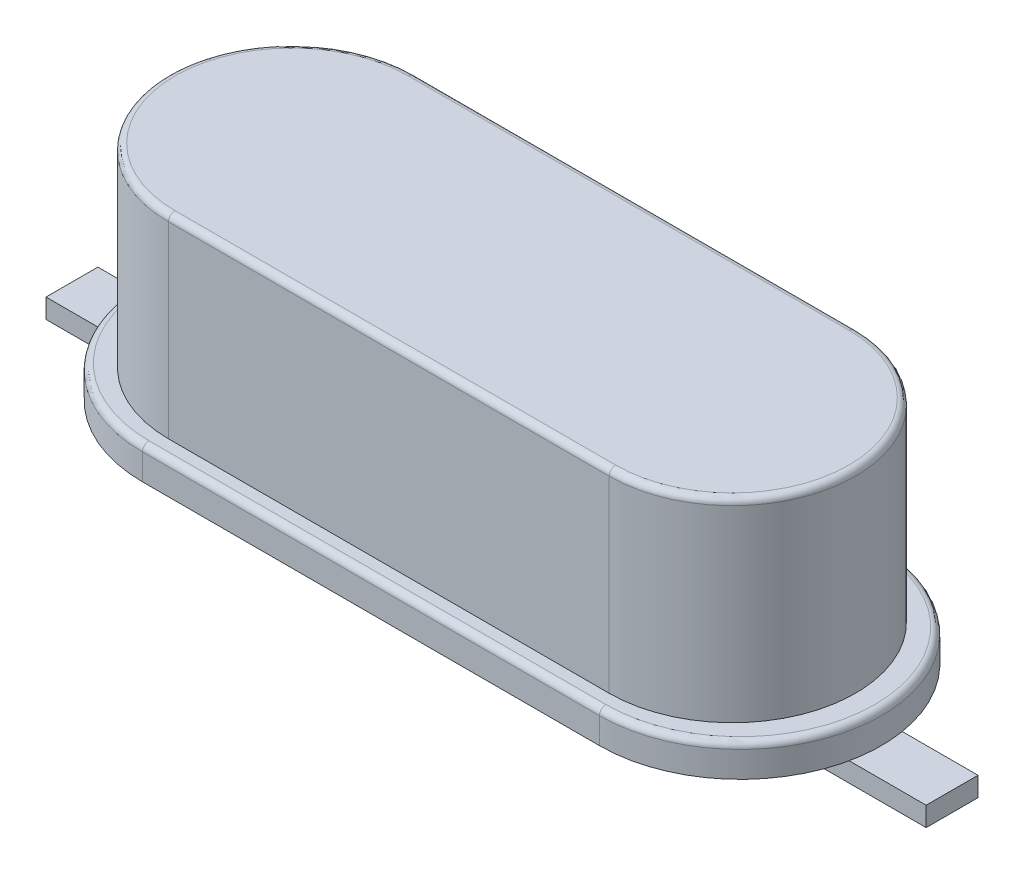
ISO-10303-21;
HEADER;
FILE_DESCRIPTION(('STEP AP214'),'2;1');
FILE_NAME('part.step','',(''),(''),'','','');
FILE_SCHEMA(('AUTOMOTIVE_DESIGN { 1 0 10303 214 1 1 1 1 }'));
ENDSEC;
DATA;
#1=APPLICATION_CONTEXT('core data for automotive mechanical design processes');
#2=APPLICATION_PROTOCOL_DEFINITION('international standard','automotive_design',2000,#1);
#3=PRODUCT_CONTEXT('',#1,'mechanical');
#4=PRODUCT('Part','Part','',(#3));
#5=PRODUCT_RELATED_PRODUCT_CATEGORY('part','',(#4));
#6=PRODUCT_DEFINITION_FORMATION('','',#4);
#7=PRODUCT_DEFINITION_CONTEXT('part definition',#1,'design');
#8=PRODUCT_DEFINITION('design','',#6,#7);
#9=PRODUCT_DEFINITION_SHAPE('','',#8);
#10=(LENGTH_UNIT() NAMED_UNIT(*) SI_UNIT(.MILLI.,.METRE.));
#11=(NAMED_UNIT(*) PLANE_ANGLE_UNIT() SI_UNIT($,.RADIAN.));
#12=(NAMED_UNIT(*) SI_UNIT($,.STERADIAN.) SOLID_ANGLE_UNIT());
#13=UNCERTAINTY_MEASURE_WITH_UNIT(LENGTH_MEASURE(1.E-05),#10,'distance_accuracy_value','');
#14=(GEOMETRIC_REPRESENTATION_CONTEXT(3) GLOBAL_UNCERTAINTY_ASSIGNED_CONTEXT((#13)) GLOBAL_UNIT_ASSIGNED_CONTEXT((#10,
#11,#12)) REPRESENTATION_CONTEXT('',''));
#15=CARTESIAN_POINT('',(0.,0.,0.));
#16=DIRECTION('',(0.,0.,1.));
#17=DIRECTION('',(1.,0.,0.));
#18=AXIS2_PLACEMENT_3D('',#15,#16,#17);
#19=CARTESIAN_POINT('',(-3.525,0.,0.));
#20=DIRECTION('',(0.,1.,0.));
#21=DIRECTION('',(0.,0.,1.));
#22=AXIS2_PLACEMENT_3D('',#19,#20,#21);
#23=PLANE('',#22);
#24=DIRECTION('',(0.,0.,1.));
#25=VECTOR('',#24,1.);
#26=CARTESIAN_POINT('',(-2.29,0.,0.4));
#27=LINE('',#26,#25);
#28=CARTESIAN_POINT('',(-2.29,0.,-0.4));
#29=VERTEX_POINT('',#28);
#30=CARTESIAN_POINT('',(-2.29,0.,0.4));
#31=VERTEX_POINT('',#30);
#32=EDGE_CURVE('E269',#29,#31,#27,.T.);
#33=ORIENTED_EDGE('',*,*,#32,.F.);
#34=DIRECTION('',(1.,0.,0.));
#35=VECTOR('',#34,1.);
#36=CARTESIAN_POINT('',(-2.59,0.,-0.4));
#37=LINE('',#36,#35);
#38=CARTESIAN_POINT('',(-2.59,0.,-0.4));
#39=VERTEX_POINT('',#38);
#40=EDGE_CURVE('E273',#39,#29,#37,.T.);
#41=ORIENTED_EDGE('',*,*,#40,.F.);
#42=DIRECTION('',(0.,0.,-1.));
#43=VECTOR('',#42,1.);
#44=CARTESIAN_POINT('',(-2.59,0.,0.4));
#45=LINE('',#44,#43);
#46=CARTESIAN_POINT('',(-2.59,0.,0.4));
#47=VERTEX_POINT('',#46);
#48=EDGE_CURVE('E282',#47,#39,#45,.T.);
#49=ORIENTED_EDGE('',*,*,#48,.F.);
#50=DIRECTION('',(-1.,0.,0.));
#51=VECTOR('',#50,1.);
#52=CARTESIAN_POINT('',(-2.59,0.,0.4));
#53=LINE('',#52,#51);
#54=EDGE_CURVE('E279',#31,#47,#53,.T.);
#55=ORIENTED_EDGE('',*,*,#54,.F.);
#56=EDGE_LOOP('',(#33,#41,#49,#55));
#57=FACE_BOUND('',#56,.T.);
#58=CARTESIAN_POINT('',(-3.525,0.,0.));
#59=DIRECTION('',(0.,1.,0.));
#60=DIRECTION('',(0.,0.,1.));
#61=AXIS2_PLACEMENT_3D('',#58,#59,#60);
#62=CIRCLE('',#61,2.175);
#63=CARTESIAN_POINT('',(-3.525,0.,-2.175));
#64=VERTEX_POINT('',#63);
#65=CARTESIAN_POINT('',(-3.525,0.,2.175));
#66=VERTEX_POINT('',#65);
#67=EDGE_CURVE('E313',#64,#66,#62,.T.);
#68=ORIENTED_EDGE('',*,*,#67,.F.);
#69=DIRECTION('',(-1.,0.,0.));
#70=VECTOR('',#69,1.);
#71=CARTESIAN_POINT('',(-3.525,0.,-2.175));
#72=LINE('',#71,#70);
#73=CARTESIAN_POINT('',(3.525,0.,-2.175));
#74=VERTEX_POINT('',#73);
#75=EDGE_CURVE('E323',#74,#64,#72,.T.);
#76=ORIENTED_EDGE('',*,*,#75,.F.);
#77=CARTESIAN_POINT('',(3.525,0.,0.));
#78=DIRECTION('',(0.,1.,0.));
#79=DIRECTION('',(0.,0.,1.));
#80=AXIS2_PLACEMENT_3D('',#77,#78,#79);
#81=CIRCLE('',#80,2.175);
#82=CARTESIAN_POINT('',(3.525,0.,2.175));
#83=VERTEX_POINT('',#82);
#84=EDGE_CURVE('E320',#83,#74,#81,.T.);
#85=ORIENTED_EDGE('',*,*,#84,.F.);
#86=DIRECTION('',(1.,0.,0.));
#87=VECTOR('',#86,1.);
#88=CARTESIAN_POINT('',(-3.525,0.,2.175));
#89=LINE('',#88,#87);
#90=EDGE_CURVE('E316',#66,#83,#89,.T.);
#91=ORIENTED_EDGE('',*,*,#90,.F.);
#92=EDGE_LOOP('',(#68,#76,#85,#91));
#93=FACE_BOUND('',#92,.T.);
#94=DIRECTION('',(-1.,0.,0.));
#95=VECTOR('',#94,1.);
#96=CARTESIAN_POINT('',(2.59,0.,0.4));
#97=LINE('',#96,#95);
#98=CARTESIAN_POINT('',(2.59,0.,0.4));
#99=VERTEX_POINT('',#98);
#100=CARTESIAN_POINT('',(2.29,0.,0.4));
#101=VERTEX_POINT('',#100);
#102=EDGE_CURVE('E249',#99,#101,#97,.T.);
#103=ORIENTED_EDGE('',*,*,#102,.F.);
#104=DIRECTION('',(0.,0.,1.));
#105=VECTOR('',#104,1.);
#106=CARTESIAN_POINT('',(2.59,0.,0.4));
#107=LINE('',#106,#105);
#108=CARTESIAN_POINT('',(2.59,0.,-0.4));
#109=VERTEX_POINT('',#108);
#110=EDGE_CURVE('E254',#109,#99,#107,.T.);
#111=ORIENTED_EDGE('',*,*,#110,.F.);
#112=DIRECTION('',(1.,0.,0.));
#113=VECTOR('',#112,1.);
#114=CARTESIAN_POINT('',(2.59,0.,-0.4));
#115=LINE('',#114,#113);
#116=CARTESIAN_POINT('',(2.29,0.,-0.4));
#117=VERTEX_POINT('',#116);
#118=EDGE_CURVE('E262',#117,#109,#115,.T.);
#119=ORIENTED_EDGE('',*,*,#118,.F.);
#120=DIRECTION('',(0.,0.,-1.));
#121=VECTOR('',#120,1.);
#122=CARTESIAN_POINT('',(2.29,0.,0.4));
#123=LINE('',#122,#121);
#124=EDGE_CURVE('E259',#101,#117,#123,.T.);
#125=ORIENTED_EDGE('',*,*,#124,.F.);
#126=EDGE_LOOP('',(#103,#111,#119,#125));
#127=FACE_BOUND('',#126,.T.);
#128=ADVANCED_FACE('F32',(#57,#93,#127),#23,.F.);
#129=CARTESIAN_POINT('',(-3.525,0.5,0.));
#130=DIRECTION('',(0.,1.,0.));
#131=DIRECTION('',(0.,0.,1.));
#132=AXIS2_PLACEMENT_3D('',#129,#130,#131);
#133=PLANE('',#132);
#134=CARTESIAN_POINT('',(3.525,0.5,0.));
#135=DIRECTION('',(0.,1.,0.));
#136=DIRECTION('',(0.,0.,1.));
#137=AXIS2_PLACEMENT_3D('',#134,#135,#136);
#138=CIRCLE('',#137,2.075);
#139=CARTESIAN_POINT('',(3.525,0.5,2.075));
#140=VERTEX_POINT('',#139);
#141=CARTESIAN_POINT('',(3.525,0.5,-2.075));
#142=VERTEX_POINT('',#141);
#143=EDGE_CURVE('E338',#140,#142,#138,.T.);
#144=ORIENTED_EDGE('',*,*,#143,.T.);
#145=DIRECTION('',(-1.,0.,0.));
#146=VECTOR('',#145,1.);
#147=CARTESIAN_POINT('',(-3.525,0.5,-2.075));
#148=LINE('',#147,#146);
#149=CARTESIAN_POINT('',(-3.525,0.5,-2.075));
#150=VERTEX_POINT('',#149);
#151=EDGE_CURVE('E340',#142,#150,#148,.T.);
#152=ORIENTED_EDGE('',*,*,#151,.T.);
#153=CARTESIAN_POINT('',(-3.525,0.5,0.));
#154=DIRECTION('',(0.,1.,0.));
#155=DIRECTION('',(0.,0.,1.));
#156=AXIS2_PLACEMENT_3D('',#153,#154,#155);
#157=CIRCLE('',#156,2.075);
#158=CARTESIAN_POINT('',(-3.525,0.5,2.075));
#159=VERTEX_POINT('',#158);
#160=EDGE_CURVE('E334',#150,#159,#157,.T.);
#161=ORIENTED_EDGE('',*,*,#160,.T.);
#162=DIRECTION('',(1.,0.,0.));
#163=VECTOR('',#162,1.);
#164=CARTESIAN_POINT('',(3.525,0.5,2.075));
#165=LINE('',#164,#163);
#166=EDGE_CURVE('E336',#159,#140,#165,.T.);
#167=ORIENTED_EDGE('',*,*,#166,.T.);
#168=EDGE_LOOP('',(#144,#152,#161,#167));
#169=FACE_BOUND('',#168,.T.);
#170=DIRECTION('',(1.,0.,0.));
#171=VECTOR('',#170,1.);
#172=CARTESIAN_POINT('',(-3.4,0.5,1.9));
#173=LINE('',#172,#171);
#174=CARTESIAN_POINT('',(-3.4,0.5,1.9));
#175=VERTEX_POINT('',#174);
#176=CARTESIAN_POINT('',(3.4,0.5,1.9));
#177=VERTEX_POINT('',#176);
#178=EDGE_CURVE('E294',#175,#177,#173,.T.);
#179=ORIENTED_EDGE('',*,*,#178,.F.);
#180=CARTESIAN_POINT('',(-3.4,0.5,0.));
#181=DIRECTION('',(0.,1.,0.));
#182=DIRECTION('',(0.,0.,1.));
#183=AXIS2_PLACEMENT_3D('',#180,#181,#182);
#184=CIRCLE('',#183,1.9);
#185=CARTESIAN_POINT('',(-3.4,0.5,-1.9));
#186=VERTEX_POINT('',#185);
#187=EDGE_CURVE('E291',#186,#175,#184,.T.);
#188=ORIENTED_EDGE('',*,*,#187,.F.);
#189=DIRECTION('',(-1.,0.,0.));
#190=VECTOR('',#189,1.);
#191=CARTESIAN_POINT('',(-3.4,0.5,-1.9));
#192=LINE('',#191,#190);
#193=CARTESIAN_POINT('',(3.4,0.5,-1.9));
#194=VERTEX_POINT('',#193);
#195=EDGE_CURVE('E301',#194,#186,#192,.T.);
#196=ORIENTED_EDGE('',*,*,#195,.F.);
#197=CARTESIAN_POINT('',(3.4,0.5,0.));
#198=DIRECTION('',(0.,1.,0.));
#199=DIRECTION('',(0.,0.,1.));
#200=AXIS2_PLACEMENT_3D('',#197,#198,#199);
#201=CIRCLE('',#200,1.9);
#202=EDGE_CURVE('E298',#177,#194,#201,.T.);
#203=ORIENTED_EDGE('',*,*,#202,.F.);
#204=EDGE_LOOP('',(#179,#188,#196,#203));
#205=FACE_BOUND('',#204,.T.);
#206=ADVANCED_FACE('F448',(#169,#205),#133,.T.);
#207=CARTESIAN_POINT('',(-3.525,0.5,0.));
#208=DIRECTION('',(0.,-1.,0.));
#209=DIRECTION('',(0.,0.,-1.));
#210=AXIS2_PLACEMENT_3D('',#207,#208,#209);
#211=CYLINDRICAL_SURFACE('',#210,2.175);
#212=DIRECTION('',(0.,-1.,0.));
#213=VECTOR('',#212,1.);
#214=CARTESIAN_POINT('',(-3.525,0.5,2.175));
#215=LINE('',#214,#213);
#216=CARTESIAN_POINT('',(-3.525,0.4,2.175));
#217=VERTEX_POINT('',#216);
#218=EDGE_CURVE('E332',#217,#66,#215,.T.);
#219=ORIENTED_EDGE('',*,*,#218,.F.);
#220=CARTESIAN_POINT('',(-3.525,0.4,0.));
#221=DIRECTION('',(0.,1.,0.));
#222=DIRECTION('',(0.,0.,1.));
#223=AXIS2_PLACEMENT_3D('',#220,#221,#222);
#224=CIRCLE('',#223,2.175);
#225=CARTESIAN_POINT('',(-3.525,0.4,-2.175));
#226=VERTEX_POINT('',#225);
#227=EDGE_CURVE('E350',#217,#226,#224,.F.);
#228=ORIENTED_EDGE('',*,*,#227,.T.);
#229=DIRECTION('',(0.,-1.,0.));
#230=VECTOR('',#229,1.);
#231=CARTESIAN_POINT('',(-3.525,0.5,-2.175));
#232=LINE('',#231,#230);
#233=EDGE_CURVE('E326',#226,#64,#232,.T.);
#234=ORIENTED_EDGE('',*,*,#233,.T.);
#235=ORIENTED_EDGE('',*,*,#67,.T.);
#236=EDGE_LOOP('',(#219,#228,#234,#235));
#237=FACE_BOUND('',#236,.T.);
#238=ADVANCED_FACE('F453',(#237),#211,.T.);
#239=CARTESIAN_POINT('',(-3.525,0.5,2.175));
#240=DIRECTION('',(0.,0.,-1.));
#241=DIRECTION('',(-1.,0.,0.));
#242=AXIS2_PLACEMENT_3D('',#239,#240,#241);
#243=PLANE('',#242);
#244=DIRECTION('',(0.,-1.,0.));
#245=VECTOR('',#244,1.);
#246=CARTESIAN_POINT('',(3.525,0.5,2.175));
#247=LINE('',#246,#245);
#248=CARTESIAN_POINT('',(3.525,0.4,2.175));
#249=VERTEX_POINT('',#248);
#250=EDGE_CURVE('E330',#249,#83,#247,.T.);
#251=ORIENTED_EDGE('',*,*,#250,.F.);
#252=DIRECTION('',(1.,0.,0.));
#253=VECTOR('',#252,1.);
#254=CARTESIAN_POINT('',(-3.525,0.4,2.175));
#255=LINE('',#254,#253);
#256=EDGE_CURVE('E348',#249,#217,#255,.F.);
#257=ORIENTED_EDGE('',*,*,#256,.T.);
#258=ORIENTED_EDGE('',*,*,#218,.T.);
#259=ORIENTED_EDGE('',*,*,#90,.T.);
#260=EDGE_LOOP('',(#251,#257,#258,#259));
#261=FACE_BOUND('',#260,.T.);
#262=ADVANCED_FACE('F466',(#261),#243,.F.);
#263=CARTESIAN_POINT('',(3.525,0.5,0.));
#264=DIRECTION('',(0.,-1.,0.));
#265=DIRECTION('',(0.,0.,-1.));
#266=AXIS2_PLACEMENT_3D('',#263,#264,#265);
#267=CYLINDRICAL_SURFACE('',#266,2.175);
#268=DIRECTION('',(0.,-1.,0.));
#269=VECTOR('',#268,1.);
#270=CARTESIAN_POINT('',(3.525,0.5,-2.175));
#271=LINE('',#270,#269);
#272=CARTESIAN_POINT('',(3.525,0.4,-2.175));
#273=VERTEX_POINT('',#272);
#274=EDGE_CURVE('E328',#273,#74,#271,.T.);
#275=ORIENTED_EDGE('',*,*,#274,.F.);
#276=CARTESIAN_POINT('',(3.525,0.4,0.));
#277=DIRECTION('',(0.,1.,0.));
#278=DIRECTION('',(0.,0.,1.));
#279=AXIS2_PLACEMENT_3D('',#276,#277,#278);
#280=CIRCLE('',#279,2.175);
#281=EDGE_CURVE('E346',#273,#249,#280,.F.);
#282=ORIENTED_EDGE('',*,*,#281,.T.);
#283=ORIENTED_EDGE('',*,*,#250,.T.);
#284=ORIENTED_EDGE('',*,*,#84,.T.);
#285=EDGE_LOOP('',(#275,#282,#283,#284));
#286=FACE_BOUND('',#285,.T.);
#287=ADVANCED_FACE('F462',(#286),#267,.T.);
#288=CARTESIAN_POINT('',(-3.525,0.5,-2.175));
#289=DIRECTION('',(0.,0.,1.));
#290=DIRECTION('',(1.,0.,0.));
#291=AXIS2_PLACEMENT_3D('',#288,#289,#290);
#292=PLANE('',#291);
#293=ORIENTED_EDGE('',*,*,#233,.F.);
#294=DIRECTION('',(-1.,0.,0.));
#295=VECTOR('',#294,1.);
#296=CARTESIAN_POINT('',(3.525,0.4,-2.175));
#297=LINE('',#296,#295);
#298=EDGE_CURVE('E343',#226,#273,#297,.F.);
#299=ORIENTED_EDGE('',*,*,#298,.T.);
#300=ORIENTED_EDGE('',*,*,#274,.T.);
#301=ORIENTED_EDGE('',*,*,#75,.T.);
#302=EDGE_LOOP('',(#293,#299,#300,#301));
#303=FACE_BOUND('',#302,.T.);
#304=ADVANCED_FACE('F458',(#303),#292,.F.);
#305=CARTESIAN_POINT('',(-3.525,0.4,2.075));
#306=DIRECTION('',(-1.,0.,0.));
#307=DIRECTION('',(0.,0.,1.));
#308=AXIS2_PLACEMENT_3D('',#305,#306,#307);
#309=CYLINDRICAL_SURFACE('',#308,0.1);
#310=CARTESIAN_POINT('',(-3.525,0.4,2.075));
#311=DIRECTION('',(-1.,0.,0.));
#312=DIRECTION('',(0.,0.,1.));
#313=AXIS2_PLACEMENT_3D('',#310,#311,#312);
#314=CIRCLE('',#313,0.1);
#315=EDGE_CURVE('E356',#217,#159,#314,.T.);
#316=ORIENTED_EDGE('',*,*,#315,.F.);
#317=ORIENTED_EDGE('',*,*,#256,.F.);
#318=CARTESIAN_POINT('',(3.525,0.4,2.075));
#319=DIRECTION('',(1.,0.,0.));
#320=DIRECTION('',(0.,0.,-1.));
#321=AXIS2_PLACEMENT_3D('',#318,#319,#320);
#322=CIRCLE('',#321,0.1);
#323=EDGE_CURVE('E317',#140,#249,#322,.T.);
#324=ORIENTED_EDGE('',*,*,#323,.F.);
#325=ORIENTED_EDGE('',*,*,#166,.F.);
#326=EDGE_LOOP('',(#316,#317,#324,#325));
#327=FACE_BOUND('',#326,.T.);
#328=ADVANCED_FACE('F461',(#327),#309,.T.);
#329=CARTESIAN_POINT('',(3.525,0.4,0.));
#330=DIRECTION('',(0.,1.,0.));
#331=DIRECTION('',(0.,0.,1.));
#332=AXIS2_PLACEMENT_3D('',#329,#330,#331);
#333=TOROIDAL_SURFACE('',#332,2.075,0.1);
#334=ORIENTED_EDGE('',*,*,#323,.T.);
#335=ORIENTED_EDGE('',*,*,#281,.F.);
#336=CARTESIAN_POINT('',(3.525,0.4,-2.075));
#337=DIRECTION('',(-1.,0.,0.));
#338=DIRECTION('',(0.,0.,1.));
#339=AXIS2_PLACEMENT_3D('',#336,#337,#338);
#340=CIRCLE('',#339,0.1);
#341=EDGE_CURVE('E354',#142,#273,#340,.T.);
#342=ORIENTED_EDGE('',*,*,#341,.F.);
#343=ORIENTED_EDGE('',*,*,#143,.F.);
#344=EDGE_LOOP('',(#334,#335,#342,#343));
#345=FACE_BOUND('',#344,.T.);
#346=ADVANCED_FACE('F482',(#345),#333,.T.);
#347=CARTESIAN_POINT('',(-3.525,0.4,0.));
#348=DIRECTION('',(0.,1.,0.));
#349=DIRECTION('',(0.,0.,1.));
#350=AXIS2_PLACEMENT_3D('',#347,#348,#349);
#351=TOROIDAL_SURFACE('',#350,2.075,0.1);
#352=ORIENTED_EDGE('',*,*,#315,.T.);
#353=ORIENTED_EDGE('',*,*,#160,.F.);
#354=CARTESIAN_POINT('',(-3.525,0.4,-2.075));
#355=DIRECTION('',(1.,0.,0.));
#356=DIRECTION('',(0.,0.,-1.));
#357=AXIS2_PLACEMENT_3D('',#354,#355,#356);
#358=CIRCLE('',#357,0.1);
#359=EDGE_CURVE('E312',#226,#150,#358,.T.);
#360=ORIENTED_EDGE('',*,*,#359,.F.);
#361=ORIENTED_EDGE('',*,*,#227,.F.);
#362=EDGE_LOOP('',(#352,#353,#360,#361));
#363=FACE_BOUND('',#362,.T.);
#364=ADVANCED_FACE('F478',(#363),#351,.T.);
#365=CARTESIAN_POINT('',(-3.525,0.4,-2.075));
#366=DIRECTION('',(1.,0.,0.));
#367=DIRECTION('',(0.,0.,-1.));
#368=AXIS2_PLACEMENT_3D('',#365,#366,#367);
#369=CYLINDRICAL_SURFACE('',#368,0.1);
#370=ORIENTED_EDGE('',*,*,#341,.T.);
#371=ORIENTED_EDGE('',*,*,#298,.F.);
#372=ORIENTED_EDGE('',*,*,#359,.T.);
#373=ORIENTED_EDGE('',*,*,#151,.F.);
#374=EDGE_LOOP('',(#370,#371,#372,#373));
#375=FACE_BOUND('',#374,.T.);
#376=ADVANCED_FACE('F474',(#375),#369,.T.);
#377=CARTESIAN_POINT('',(-3.4,3.5,0.));
#378=DIRECTION('',(0.,-1.,0.));
#379=DIRECTION('',(0.,0.,-1.));
#380=AXIS2_PLACEMENT_3D('',#377,#378,#379);
#381=CYLINDRICAL_SURFACE('',#380,1.9);
#382=DIRECTION('',(0.,-1.,0.));
#383=VECTOR('',#382,1.);
#384=CARTESIAN_POINT('',(-3.4,3.5,1.9));
#385=LINE('',#384,#383);
#386=CARTESIAN_POINT('',(-3.4,3.4,1.9));
#387=VERTEX_POINT('',#386);
#388=EDGE_CURVE('E310',#387,#175,#385,.T.);
#389=ORIENTED_EDGE('',*,*,#388,.F.);
#390=CARTESIAN_POINT('',(-3.4,3.4,0.));
#391=DIRECTION('',(0.,1.,0.));
#392=DIRECTION('',(0.,0.,1.));
#393=AXIS2_PLACEMENT_3D('',#390,#391,#392);
#394=CIRCLE('',#393,1.9);
#395=CARTESIAN_POINT('',(-3.4,3.4,-1.9));
#396=VERTEX_POINT('',#395);
#397=EDGE_CURVE('E376',#387,#396,#394,.F.);
#398=ORIENTED_EDGE('',*,*,#397,.T.);
#399=DIRECTION('',(0.,-1.,0.));
#400=VECTOR('',#399,1.);
#401=CARTESIAN_POINT('',(-3.4,3.5,-1.9));
#402=LINE('',#401,#400);
#403=EDGE_CURVE('E304',#396,#186,#402,.T.);
#404=ORIENTED_EDGE('',*,*,#403,.T.);
#405=ORIENTED_EDGE('',*,*,#187,.T.);
#406=EDGE_LOOP('',(#389,#398,#404,#405));
#407=FACE_BOUND('',#406,.T.);
#408=ADVANCED_FACE('F477',(#407),#381,.T.);
#409=CARTESIAN_POINT('',(-3.4,3.5,1.9));
#410=DIRECTION('',(0.,0.,-1.));
#411=DIRECTION('',(-1.,0.,0.));
#412=AXIS2_PLACEMENT_3D('',#409,#410,#411);
#413=PLANE('',#412);
#414=DIRECTION('',(0.,-1.,0.));
#415=VECTOR('',#414,1.);
#416=CARTESIAN_POINT('',(3.4,3.5,1.9));
#417=LINE('',#416,#415);
#418=CARTESIAN_POINT('',(3.4,3.4,1.9));
#419=VERTEX_POINT('',#418);
#420=EDGE_CURVE('E308',#419,#177,#417,.T.);
#421=ORIENTED_EDGE('',*,*,#420,.F.);
#422=DIRECTION('',(1.,0.,0.));
#423=VECTOR('',#422,1.);
#424=CARTESIAN_POINT('',(-3.4,3.4,1.9));
#425=LINE('',#424,#423);
#426=EDGE_CURVE('E374',#419,#387,#425,.F.);
#427=ORIENTED_EDGE('',*,*,#426,.T.);
#428=ORIENTED_EDGE('',*,*,#388,.T.);
#429=ORIENTED_EDGE('',*,*,#178,.T.);
#430=EDGE_LOOP('',(#421,#427,#428,#429));
#431=FACE_BOUND('',#430,.T.);
#432=ADVANCED_FACE('F562',(#431),#413,.F.);
#433=CARTESIAN_POINT('',(3.4,3.5,0.));
#434=DIRECTION('',(0.,-1.,0.));
#435=DIRECTION('',(0.,0.,-1.));
#436=AXIS2_PLACEMENT_3D('',#433,#434,#435);
#437=CYLINDRICAL_SURFACE('',#436,1.9);
#438=DIRECTION('',(0.,-1.,0.));
#439=VECTOR('',#438,1.);
#440=CARTESIAN_POINT('',(3.4,3.5,-1.9));
#441=LINE('',#440,#439);
#442=CARTESIAN_POINT('',(3.4,3.4,-1.9));
#443=VERTEX_POINT('',#442);
#444=EDGE_CURVE('E306',#443,#194,#441,.T.);
#445=ORIENTED_EDGE('',*,*,#444,.F.);
#446=CARTESIAN_POINT('',(3.4,3.4,0.));
#447=DIRECTION('',(0.,1.,0.));
#448=DIRECTION('',(0.,0.,1.));
#449=AXIS2_PLACEMENT_3D('',#446,#447,#448);
#450=CIRCLE('',#449,1.9);
#451=EDGE_CURVE('E372',#443,#419,#450,.F.);
#452=ORIENTED_EDGE('',*,*,#451,.T.);
#453=ORIENTED_EDGE('',*,*,#420,.T.);
#454=ORIENTED_EDGE('',*,*,#202,.T.);
#455=EDGE_LOOP('',(#445,#452,#453,#454));
#456=FACE_BOUND('',#455,.T.);
#457=ADVANCED_FACE('F558',(#456),#437,.T.);
#458=CARTESIAN_POINT('',(-3.4,3.5,-1.9));
#459=DIRECTION('',(0.,0.,1.));
#460=DIRECTION('',(1.,0.,0.));
#461=AXIS2_PLACEMENT_3D('',#458,#459,#460);
#462=PLANE('',#461);
#463=ORIENTED_EDGE('',*,*,#403,.F.);
#464=DIRECTION('',(-1.,0.,0.));
#465=VECTOR('',#464,1.);
#466=CARTESIAN_POINT('',(3.4,3.4,-1.9));
#467=LINE('',#466,#465);
#468=EDGE_CURVE('E369',#396,#443,#467,.F.);
#469=ORIENTED_EDGE('',*,*,#468,.T.);
#470=ORIENTED_EDGE('',*,*,#444,.T.);
#471=ORIENTED_EDGE('',*,*,#195,.T.);
#472=EDGE_LOOP('',(#463,#469,#470,#471));
#473=FACE_BOUND('',#472,.T.);
#474=ADVANCED_FACE('F554',(#473),#462,.F.);
#475=CARTESIAN_POINT('',(-3.4,3.5,0.));
#476=DIRECTION('',(0.,1.,0.));
#477=DIRECTION('',(0.,0.,1.));
#478=AXIS2_PLACEMENT_3D('',#475,#476,#477);
#479=PLANE('',#478);
#480=CARTESIAN_POINT('',(3.4,3.5,0.));
#481=DIRECTION('',(0.,1.,0.));
#482=DIRECTION('',(0.,0.,1.));
#483=AXIS2_PLACEMENT_3D('',#480,#481,#482);
#484=CIRCLE('',#483,1.8);
#485=CARTESIAN_POINT('',(3.4,3.5,1.8));
#486=VERTEX_POINT('',#485);
#487=CARTESIAN_POINT('',(3.4,3.5,-1.8));
#488=VERTEX_POINT('',#487);
#489=EDGE_CURVE('E364',#486,#488,#484,.T.);
#490=ORIENTED_EDGE('',*,*,#489,.T.);
#491=DIRECTION('',(-1.,0.,0.));
#492=VECTOR('',#491,1.);
#493=CARTESIAN_POINT('',(-3.4,3.5,-1.8));
#494=LINE('',#493,#492);
#495=CARTESIAN_POINT('',(-3.4,3.5,-1.8));
#496=VERTEX_POINT('',#495);
#497=EDGE_CURVE('E366',#488,#496,#494,.T.);
#498=ORIENTED_EDGE('',*,*,#497,.T.);
#499=CARTESIAN_POINT('',(-3.4,3.5,0.));
#500=DIRECTION('',(0.,1.,0.));
#501=DIRECTION('',(0.,0.,1.));
#502=AXIS2_PLACEMENT_3D('',#499,#500,#501);
#503=CIRCLE('',#502,1.8);
#504=CARTESIAN_POINT('',(-3.4,3.5,1.8));
#505=VERTEX_POINT('',#504);
#506=EDGE_CURVE('E352',#496,#505,#503,.T.);
#507=ORIENTED_EDGE('',*,*,#506,.T.);
#508=DIRECTION('',(1.,0.,0.));
#509=VECTOR('',#508,1.);
#510=CARTESIAN_POINT('',(3.4,3.5,1.8));
#511=LINE('',#510,#509);
#512=EDGE_CURVE('E362',#505,#486,#511,.T.);
#513=ORIENTED_EDGE('',*,*,#512,.T.);
#514=EDGE_LOOP('',(#490,#498,#507,#513));
#515=FACE_BOUND('',#514,.T.);
#516=ADVANCED_FACE('F505',(#515),#479,.T.);
#517=CARTESIAN_POINT('',(-3.4,3.4,1.8));
#518=DIRECTION('',(-1.,0.,0.));
#519=DIRECTION('',(0.,0.,1.));
#520=AXIS2_PLACEMENT_3D('',#517,#518,#519);
#521=CYLINDRICAL_SURFACE('',#520,0.1);
#522=CARTESIAN_POINT('',(-3.4,3.4,1.8));
#523=DIRECTION('',(-1.,0.,0.));
#524=DIRECTION('',(0.,0.,1.));
#525=AXIS2_PLACEMENT_3D('',#522,#523,#524);
#526=CIRCLE('',#525,0.1);
#527=EDGE_CURVE('E382',#387,#505,#526,.T.);
#528=ORIENTED_EDGE('',*,*,#527,.F.);
#529=ORIENTED_EDGE('',*,*,#426,.F.);
#530=CARTESIAN_POINT('',(3.4,3.4,1.8));
#531=DIRECTION('',(1.,0.,0.));
#532=DIRECTION('',(0.,0.,-1.));
#533=AXIS2_PLACEMENT_3D('',#530,#531,#532);
#534=CIRCLE('',#533,0.1);
#535=EDGE_CURVE('E295',#486,#419,#534,.T.);
#536=ORIENTED_EDGE('',*,*,#535,.F.);
#537=ORIENTED_EDGE('',*,*,#512,.F.);
#538=EDGE_LOOP('',(#528,#529,#536,#537));
#539=FACE_BOUND('',#538,.T.);
#540=ADVANCED_FACE('F501',(#539),#521,.T.);
#541=CARTESIAN_POINT('',(3.4,3.4,0.));
#542=DIRECTION('',(0.,1.,0.));
#543=DIRECTION('',(0.,0.,1.));
#544=AXIS2_PLACEMENT_3D('',#541,#542,#543);
#545=TOROIDAL_SURFACE('',#544,1.8,0.1);
#546=ORIENTED_EDGE('',*,*,#535,.T.);
#547=ORIENTED_EDGE('',*,*,#451,.F.);
#548=CARTESIAN_POINT('',(3.4,3.4,-1.8));
#549=DIRECTION('',(-1.,0.,0.));
#550=DIRECTION('',(0.,0.,1.));
#551=AXIS2_PLACEMENT_3D('',#548,#549,#550);
#552=CIRCLE('',#551,0.1);
#553=EDGE_CURVE('E380',#488,#443,#552,.T.);
#554=ORIENTED_EDGE('',*,*,#553,.F.);
#555=ORIENTED_EDGE('',*,*,#489,.F.);
#556=EDGE_LOOP('',(#546,#547,#554,#555));
#557=FACE_BOUND('',#556,.T.);
#558=ADVANCED_FACE('F497',(#557),#545,.T.);
#559=CARTESIAN_POINT('',(-3.4,3.4,0.));
#560=DIRECTION('',(0.,1.,0.));
#561=DIRECTION('',(0.,0.,1.));
#562=AXIS2_PLACEMENT_3D('',#559,#560,#561);
#563=TOROIDAL_SURFACE('',#562,1.8,0.1);
#564=ORIENTED_EDGE('',*,*,#527,.T.);
#565=ORIENTED_EDGE('',*,*,#506,.F.);
#566=CARTESIAN_POINT('',(-3.4,3.4,-1.8));
#567=DIRECTION('',(1.,0.,0.));
#568=DIRECTION('',(0.,0.,-1.));
#569=AXIS2_PLACEMENT_3D('',#566,#567,#568);
#570=CIRCLE('',#569,0.1);
#571=EDGE_CURVE('E290',#396,#496,#570,.T.);
#572=ORIENTED_EDGE('',*,*,#571,.F.);
#573=ORIENTED_EDGE('',*,*,#397,.F.);
#574=EDGE_LOOP('',(#564,#565,#572,#573));
#575=FACE_BOUND('',#574,.T.);
#576=ADVANCED_FACE('F493',(#575),#563,.T.);
#577=CARTESIAN_POINT('',(-3.4,3.4,-1.8));
#578=DIRECTION('',(1.,0.,0.));
#579=DIRECTION('',(0.,0.,-1.));
#580=AXIS2_PLACEMENT_3D('',#577,#578,#579);
#581=CYLINDRICAL_SURFACE('',#580,0.1);
#582=ORIENTED_EDGE('',*,*,#553,.T.);
#583=ORIENTED_EDGE('',*,*,#468,.F.);
#584=ORIENTED_EDGE('',*,*,#571,.T.);
#585=ORIENTED_EDGE('',*,*,#497,.F.);
#586=EDGE_LOOP('',(#582,#583,#584,#585));
#587=FACE_BOUND('',#586,.T.);
#588=ADVANCED_FACE('F490',(#587),#581,.T.);
#589=CARTESIAN_POINT('',(-2.29,-0.35,0.4));
#590=DIRECTION('',(-1.,0.,0.));
#591=DIRECTION('',(0.,0.,1.));
#592=AXIS2_PLACEMENT_3D('',#589,#590,#591);
#593=PLANE('',#592);
#594=DIRECTION('',(0.,1.,0.));
#595=VECTOR('',#594,1.);
#596=CARTESIAN_POINT('',(-2.29,-0.35,0.4));
#597=LINE('',#596,#595);
#598=CARTESIAN_POINT('',(-2.29,-0.15,0.4));
#599=VERTEX_POINT('',#598);
#600=EDGE_CURVE('E288',#599,#31,#597,.T.);
#601=ORIENTED_EDGE('',*,*,#600,.F.);
#602=DIRECTION('',(0.,0.,1.));
#603=VECTOR('',#602,1.);
#604=CARTESIAN_POINT('',(-2.29,-0.15,-0.4));
#605=LINE('',#604,#603);
#606=CARTESIAN_POINT('',(-2.29,-0.15,-0.4));
#607=VERTEX_POINT('',#606);
#608=EDGE_CURVE('E47',#599,#607,#605,.F.);
#609=ORIENTED_EDGE('',*,*,#608,.T.);
#610=DIRECTION('',(0.,1.,0.));
#611=VECTOR('',#610,1.);
#612=CARTESIAN_POINT('',(-2.29,-0.35,-0.4));
#613=LINE('',#612,#611);
#614=EDGE_CURVE('E276',#607,#29,#613,.T.);
#615=ORIENTED_EDGE('',*,*,#614,.T.);
#616=ORIENTED_EDGE('',*,*,#32,.T.);
#617=EDGE_LOOP('',(#601,#609,#615,#616));
#618=FACE_BOUND('',#617,.T.);
#619=ADVANCED_FACE('F429',(#618),#593,.F.);
#620=CARTESIAN_POINT('',(-2.59,-0.35,0.4));
#621=DIRECTION('',(0.,0.,-1.));
#622=DIRECTION('',(-1.,0.,0.));
#623=AXIS2_PLACEMENT_3D('',#620,#621,#622);
#624=PLANE('',#623);
#625=DIRECTION('',(-1.,0.,0.));
#626=VECTOR('',#625,1.);
#627=CARTESIAN_POINT('',(-2.59,-0.35,0.4));
#628=LINE('',#627,#626);
#629=CARTESIAN_POINT('',(-2.49,-0.35,0.4));
#630=VERTEX_POINT('',#629);
#631=CARTESIAN_POINT('',(-6.79,-0.35,0.400000000000006));
#632=VERTEX_POINT('',#631);
#633=EDGE_CURVE('E270',#630,#632,#628,.T.);
#634=ORIENTED_EDGE('',*,*,#633,.F.);
#635=CARTESIAN_POINT('',(-2.49,-0.15,0.4));
#636=DIRECTION('',(0.,0.,-1.));
#637=DIRECTION('',(-1.,0.,0.));
#638=AXIS2_PLACEMENT_3D('',#635,#636,#637);
#639=CIRCLE('',#638,0.2);
#640=EDGE_CURVE('E55',#630,#599,#639,.F.);
#641=ORIENTED_EDGE('',*,*,#640,.T.);
#642=ORIENTED_EDGE('',*,*,#600,.T.);
#643=ORIENTED_EDGE('',*,*,#54,.T.);
#644=CARTESIAN_POINT('',(-2.72228756555323,0.15,0.4));
#645=DIRECTION('',(0.,0.,-1.));
#646=DIRECTION('',(-1.,0.,0.));
#647=AXIS2_PLACEMENT_3D('',#644,#645,#646);
#648=CIRCLE('',#647,0.2);
#649=CARTESIAN_POINT('',(-2.72228756555323,-0.05,0.4));
#650=VERTEX_POINT('',#649);
#651=EDGE_CURVE('E409',#47,#650,#648,.T.);
#652=ORIENTED_EDGE('',*,*,#651,.T.);
#653=DIRECTION('',(1.,0.,0.));
#654=VECTOR('',#653,1.);
#655=CARTESIAN_POINT('',(-6.79,-0.05,0.400000000000006));
#656=LINE('',#655,#654);
#657=CARTESIAN_POINT('',(-6.79,-0.05,0.400000000000006));
#658=VERTEX_POINT('',#657);
#659=EDGE_CURVE('E246',#658,#650,#656,.T.);
#660=ORIENTED_EDGE('',*,*,#659,.F.);
#661=DIRECTION('',(0.,1.,0.));
#662=VECTOR('',#661,1.);
#663=CARTESIAN_POINT('',(-6.79,-0.05,0.400000000000006));
#664=LINE('',#663,#662);
#665=EDGE_CURVE('E239',#632,#658,#664,.T.);
#666=ORIENTED_EDGE('',*,*,#665,.F.);
#667=EDGE_LOOP('',(#634,#641,#642,#643,#652,#660,#666));
#668=FACE_BOUND('',#667,.T.);
#669=ADVANCED_FACE('F412',(#668),#624,.F.);
#670=CARTESIAN_POINT('',(-2.59,-0.35,-0.4));
#671=DIRECTION('',(0.,0.,1.));
#672=DIRECTION('',(1.,0.,0.));
#673=AXIS2_PLACEMENT_3D('',#670,#671,#672);
#674=PLANE('',#673);
#675=ORIENTED_EDGE('',*,*,#614,.F.);
#676=CARTESIAN_POINT('',(-2.49,-0.15,-0.4));
#677=DIRECTION('',(0.,0.,1.));
#678=DIRECTION('',(1.,0.,0.));
#679=AXIS2_PLACEMENT_3D('',#676,#677,#678);
#680=CIRCLE('',#679,0.2);
#681=CARTESIAN_POINT('',(-2.49,-0.35,-0.4));
#682=VERTEX_POINT('',#681);
#683=EDGE_CURVE('E405',#607,#682,#680,.F.);
#684=ORIENTED_EDGE('',*,*,#683,.T.);
#685=DIRECTION('',(1.,0.,0.));
#686=VECTOR('',#685,1.);
#687=CARTESIAN_POINT('',(-2.59,-0.35,-0.4));
#688=LINE('',#687,#686);
#689=CARTESIAN_POINT('',(-6.79,-0.35,-0.399999999999994));
#690=VERTEX_POINT('',#689);
#691=EDGE_CURVE('E272',#690,#682,#688,.T.);
#692=ORIENTED_EDGE('',*,*,#691,.F.);
#693=DIRECTION('',(0.,-1.,0.));
#694=VECTOR('',#693,1.);
#695=CARTESIAN_POINT('',(-6.79,-0.05,-0.399999999999994));
#696=LINE('',#695,#694);
#697=CARTESIAN_POINT('',(-6.79,-0.05,-0.399999999999994));
#698=VERTEX_POINT('',#697);
#699=EDGE_CURVE('E214',#698,#690,#696,.T.);
#700=ORIENTED_EDGE('',*,*,#699,.F.);
#701=DIRECTION('',(1.,0.,0.));
#702=VECTOR('',#701,1.);
#703=CARTESIAN_POINT('',(-6.79,-0.05,-0.399999999999994));
#704=LINE('',#703,#702);
#705=CARTESIAN_POINT('',(-2.72228756555323,-0.05,-0.4));
#706=VERTEX_POINT('',#705);
#707=EDGE_CURVE('E243',#698,#706,#704,.T.);
#708=ORIENTED_EDGE('',*,*,#707,.T.);
#709=CARTESIAN_POINT('',(-2.72228756555323,0.15,-0.4));
#710=DIRECTION('',(0.,0.,1.));
#711=DIRECTION('',(1.,0.,0.));
#712=AXIS2_PLACEMENT_3D('',#709,#710,#711);
#713=CIRCLE('',#712,0.2);
#714=EDGE_CURVE('E407',#706,#39,#713,.T.);
#715=ORIENTED_EDGE('',*,*,#714,.T.);
#716=ORIENTED_EDGE('',*,*,#40,.T.);
#717=EDGE_LOOP('',(#675,#684,#692,#700,#708,#715,#716));
#718=FACE_BOUND('',#717,.T.);
#719=ADVANCED_FACE('F424',(#718),#674,.F.);
#720=CARTESIAN_POINT('',(0.,-0.35,0.));
#721=DIRECTION('',(0.,-1.,0.));
#722=DIRECTION('',(0.,0.,-1.));
#723=AXIS2_PLACEMENT_3D('',#720,#721,#722);
#724=PLANE('',#723);
#725=ORIENTED_EDGE('',*,*,#691,.T.);
#726=DIRECTION('',(0.,0.,1.));
#727=VECTOR('',#726,1.);
#728=CARTESIAN_POINT('',(-2.49,-0.35,0.4));
#729=LINE('',#728,#727);
#730=EDGE_CURVE('E400',#682,#630,#729,.T.);
#731=ORIENTED_EDGE('',*,*,#730,.T.);
#732=ORIENTED_EDGE('',*,*,#633,.T.);
#733=DIRECTION('',(0.,0.,1.));
#734=VECTOR('',#733,1.);
#735=CARTESIAN_POINT('',(-6.79,-0.35,-0.399999999999994));
#736=LINE('',#735,#734);
#737=EDGE_CURVE('E236',#690,#632,#736,.T.);
#738=ORIENTED_EDGE('',*,*,#737,.F.);
#739=EDGE_LOOP('',(#725,#731,#732,#738));
#740=FACE_BOUND('',#739,.T.);
#741=ADVANCED_FACE('F434',(#740),#724,.T.);
#742=CARTESIAN_POINT('',(2.59,-0.35,0.4));
#743=DIRECTION('',(0.,0.,-1.));
#744=DIRECTION('',(-1.,0.,0.));
#745=AXIS2_PLACEMENT_3D('',#742,#743,#744);
#746=PLANE('',#745);
#747=DIRECTION('',(0.,1.,0.));
#748=VECTOR('',#747,1.);
#749=CARTESIAN_POINT('',(2.29,-0.35,0.4));
#750=LINE('',#749,#748);
#751=CARTESIAN_POINT('',(2.29,-0.15,0.4));
#752=VERTEX_POINT('',#751);
#753=EDGE_CURVE('E267',#752,#101,#750,.T.);
#754=ORIENTED_EDGE('',*,*,#753,.F.);
#755=CARTESIAN_POINT('',(2.49,-0.15,0.4));
#756=DIRECTION('',(0.,0.,-1.));
#757=DIRECTION('',(-1.,0.,0.));
#758=AXIS2_PLACEMENT_3D('',#755,#756,#757);
#759=CIRCLE('',#758,0.2);
#760=CARTESIAN_POINT('',(2.49,-0.35,0.4));
#761=VERTEX_POINT('',#760);
#762=EDGE_CURVE('E398',#752,#761,#759,.F.);
#763=ORIENTED_EDGE('',*,*,#762,.T.);
#764=DIRECTION('',(-1.,0.,0.));
#765=VECTOR('',#764,1.);
#766=CARTESIAN_POINT('',(2.59,-0.35,0.4));
#767=LINE('',#766,#765);
#768=CARTESIAN_POINT('',(6.79,-0.35,0.400000000000006));
#769=VERTEX_POINT('',#768);
#770=EDGE_CURVE('E250',#769,#761,#767,.T.);
#771=ORIENTED_EDGE('',*,*,#770,.F.);
#772=DIRECTION('',(0.,1.,0.));
#773=VECTOR('',#772,1.);
#774=CARTESIAN_POINT('',(6.79,-0.05,0.400000000000006));
#775=LINE('',#774,#773);
#776=CARTESIAN_POINT('',(6.79,-0.05,0.400000000000006));
#777=VERTEX_POINT('',#776);
#778=EDGE_CURVE('E228',#769,#777,#775,.T.);
#779=ORIENTED_EDGE('',*,*,#778,.T.);
#780=DIRECTION('',(-1.,0.,0.));
#781=VECTOR('',#780,1.);
#782=CARTESIAN_POINT('',(6.79,-0.05,0.400000000000006));
#783=LINE('',#782,#781);
#784=CARTESIAN_POINT('',(2.72228756555323,-0.05,0.4));
#785=VERTEX_POINT('',#784);
#786=EDGE_CURVE('E215',#777,#785,#783,.T.);
#787=ORIENTED_EDGE('',*,*,#786,.T.);
#788=CARTESIAN_POINT('',(2.72228756555323,0.15,0.4));
#789=DIRECTION('',(0.,0.,-1.));
#790=DIRECTION('',(-1.,0.,0.));
#791=AXIS2_PLACEMENT_3D('',#788,#789,#790);
#792=CIRCLE('',#791,0.2);
#793=EDGE_CURVE('E11',#785,#99,#792,.T.);
#794=ORIENTED_EDGE('',*,*,#793,.T.);
#795=ORIENTED_EDGE('',*,*,#102,.T.);
#796=EDGE_LOOP('',(#754,#763,#771,#779,#787,#794,#795));
#797=FACE_BOUND('',#796,.T.);
#798=ADVANCED_FACE('F523',(#797),#746,.F.);
#799=CARTESIAN_POINT('',(2.29,-0.35,0.4));
#800=DIRECTION('',(1.,0.,0.));
#801=DIRECTION('',(0.,0.,-1.));
#802=AXIS2_PLACEMENT_3D('',#799,#800,#801);
#803=PLANE('',#802);
#804=DIRECTION('',(0.,1.,0.));
#805=VECTOR('',#804,1.);
#806=CARTESIAN_POINT('',(2.29,-0.35,-0.4));
#807=LINE('',#806,#805);
#808=CARTESIAN_POINT('',(2.29,-0.15,-0.4));
#809=VERTEX_POINT('',#808);
#810=EDGE_CURVE('E256',#809,#117,#807,.T.);
#811=ORIENTED_EDGE('',*,*,#810,.F.);
#812=DIRECTION('',(0.,0.,-1.));
#813=VECTOR('',#812,1.);
#814=CARTESIAN_POINT('',(2.29,-0.15,0.4));
#815=LINE('',#814,#813);
#816=EDGE_CURVE('E396',#809,#752,#815,.F.);
#817=ORIENTED_EDGE('',*,*,#816,.T.);
#818=ORIENTED_EDGE('',*,*,#753,.T.);
#819=ORIENTED_EDGE('',*,*,#124,.T.);
#820=EDGE_LOOP('',(#811,#817,#818,#819));
#821=FACE_BOUND('',#820,.T.);
#822=ADVANCED_FACE('F528',(#821),#803,.F.);
#823=CARTESIAN_POINT('',(2.59,-0.35,-0.4));
#824=DIRECTION('',(0.,0.,1.));
#825=DIRECTION('',(1.,0.,0.));
#826=AXIS2_PLACEMENT_3D('',#823,#824,#825);
#827=PLANE('',#826);
#828=DIRECTION('',(1.,0.,0.));
#829=VECTOR('',#828,1.);
#830=CARTESIAN_POINT('',(2.59,-0.35,-0.4));
#831=LINE('',#830,#829);
#832=CARTESIAN_POINT('',(2.49,-0.35,-0.4));
#833=VERTEX_POINT('',#832);
#834=CARTESIAN_POINT('',(6.79,-0.35,-0.399999999999994));
#835=VERTEX_POINT('',#834);
#836=EDGE_CURVE('E253',#833,#835,#831,.T.);
#837=ORIENTED_EDGE('',*,*,#836,.F.);
#838=CARTESIAN_POINT('',(2.49,-0.15,-0.4));
#839=DIRECTION('',(0.,0.,1.));
#840=DIRECTION('',(1.,0.,0.));
#841=AXIS2_PLACEMENT_3D('',#838,#839,#840);
#842=CIRCLE('',#841,0.2);
#843=EDGE_CURVE('E394',#833,#809,#842,.F.);
#844=ORIENTED_EDGE('',*,*,#843,.T.);
#845=ORIENTED_EDGE('',*,*,#810,.T.);
#846=ORIENTED_EDGE('',*,*,#118,.T.);
#847=CARTESIAN_POINT('',(2.72228756555323,0.15,-0.4));
#848=DIRECTION('',(0.,0.,1.));
#849=DIRECTION('',(1.,0.,0.));
#850=AXIS2_PLACEMENT_3D('',#847,#848,#849);
#851=CIRCLE('',#850,0.2);
#852=CARTESIAN_POINT('',(2.72228756555323,-0.05,-0.4));
#853=VERTEX_POINT('',#852);
#854=EDGE_CURVE('E40',#109,#853,#851,.T.);
#855=ORIENTED_EDGE('',*,*,#854,.T.);
#856=DIRECTION('',(-1.,0.,0.));
#857=VECTOR('',#856,1.);
#858=CARTESIAN_POINT('',(6.79,-0.05,-0.399999999999994));
#859=LINE('',#858,#857);
#860=CARTESIAN_POINT('',(6.79,-0.05,-0.399999999999994));
#861=VERTEX_POINT('',#860);
#862=EDGE_CURVE('E204',#861,#853,#859,.T.);
#863=ORIENTED_EDGE('',*,*,#862,.F.);
#864=DIRECTION('',(0.,-1.,0.));
#865=VECTOR('',#864,1.);
#866=CARTESIAN_POINT('',(6.79,-0.05,-0.399999999999994));
#867=LINE('',#866,#865);
#868=EDGE_CURVE('E208',#861,#835,#867,.T.);
#869=ORIENTED_EDGE('',*,*,#868,.T.);
#870=EDGE_LOOP('',(#837,#844,#845,#846,#855,#863,#869));
#871=FACE_BOUND('',#870,.T.);
#872=ADVANCED_FACE('F207',(#871),#827,.F.);
#873=CARTESIAN_POINT('',(0.,-0.35,0.));
#874=DIRECTION('',(0.,-1.,0.));
#875=DIRECTION('',(0.,0.,-1.));
#876=AXIS2_PLACEMENT_3D('',#873,#874,#875);
#877=PLANE('',#876);
#878=ORIENTED_EDGE('',*,*,#770,.T.);
#879=DIRECTION('',(0.,0.,-1.));
#880=VECTOR('',#879,1.);
#881=CARTESIAN_POINT('',(2.49,-0.35,-0.4));
#882=LINE('',#881,#880);
#883=EDGE_CURVE('E391',#761,#833,#882,.T.);
#884=ORIENTED_EDGE('',*,*,#883,.T.);
#885=ORIENTED_EDGE('',*,*,#836,.T.);
#886=DIRECTION('',(0.,0.,1.));
#887=VECTOR('',#886,1.);
#888=CARTESIAN_POINT('',(6.79,-0.35,-0.399999999999994));
#889=LINE('',#888,#887);
#890=EDGE_CURVE('E224',#835,#769,#889,.T.);
#891=ORIENTED_EDGE('',*,*,#890,.T.);
#892=EDGE_LOOP('',(#878,#884,#885,#891));
#893=FACE_BOUND('',#892,.T.);
#894=ADVANCED_FACE('F445',(#893),#877,.T.);
#895=CARTESIAN_POINT('',(-6.79,-0.05,-0.399999999999994));
#896=DIRECTION('',(0.,-1.,0.));
#897=DIRECTION('',(0.,0.,-1.));
#898=AXIS2_PLACEMENT_3D('',#895,#896,#897);
#899=PLANE('',#898);
#900=ORIENTED_EDGE('',*,*,#659,.T.);
#901=DIRECTION('',(0.,0.,1.));
#902=VECTOR('',#901,1.);
#903=CARTESIAN_POINT('',(-2.72228756555323,-0.05,-0.399999999999996));
#904=LINE('',#903,#902);
#905=EDGE_CURVE('E378',#650,#706,#904,.F.);
#906=ORIENTED_EDGE('',*,*,#905,.T.);
#907=ORIENTED_EDGE('',*,*,#707,.F.);
#908=DIRECTION('',(0.,0.,-1.));
#909=VECTOR('',#908,1.);
#910=CARTESIAN_POINT('',(-6.79,-0.05,-0.399999999999994));
#911=LINE('',#910,#909);
#912=EDGE_CURVE('E241',#658,#698,#911,.T.);
#913=ORIENTED_EDGE('',*,*,#912,.F.);
#914=EDGE_LOOP('',(#900,#906,#907,#913));
#915=FACE_BOUND('',#914,.T.);
#916=ADVANCED_FACE('F419',(#915),#899,.F.);
#917=CARTESIAN_POINT('',(-6.79,0.,0.));
#918=DIRECTION('',(-1.,0.,0.));
#919=DIRECTION('',(0.,0.,1.));
#920=AXIS2_PLACEMENT_3D('',#917,#918,#919);
#921=PLANE('',#920);
#922=ORIENTED_EDGE('',*,*,#699,.T.);
#923=ORIENTED_EDGE('',*,*,#737,.T.);
#924=ORIENTED_EDGE('',*,*,#665,.T.);
#925=ORIENTED_EDGE('',*,*,#912,.T.);
#926=EDGE_LOOP('',(#922,#923,#924,#925));
#927=FACE_BOUND('',#926,.T.);
#928=ADVANCED_FACE('F437',(#927),#921,.T.);
#929=CARTESIAN_POINT('',(6.79,-0.05,-0.399999999999994));
#930=DIRECTION('',(0.,1.,0.));
#931=DIRECTION('',(0.,0.,1.));
#932=AXIS2_PLACEMENT_3D('',#929,#930,#931);
#933=PLANE('',#932);
#934=ORIENTED_EDGE('',*,*,#862,.T.);
#935=DIRECTION('',(0.,0.,1.));
#936=VECTOR('',#935,1.);
#937=CARTESIAN_POINT('',(2.72228756555323,-0.05,0.4));
#938=LINE('',#937,#936);
#939=EDGE_CURVE('E389',#853,#785,#938,.T.);
#940=ORIENTED_EDGE('',*,*,#939,.T.);
#941=ORIENTED_EDGE('',*,*,#786,.F.);
#942=DIRECTION('',(0.,0.,-1.));
#943=VECTOR('',#942,1.);
#944=CARTESIAN_POINT('',(6.79,-0.05,-0.399999999999994));
#945=LINE('',#944,#943);
#946=EDGE_CURVE('E221',#777,#861,#945,.T.);
#947=ORIENTED_EDGE('',*,*,#946,.T.);
#948=EDGE_LOOP('',(#934,#940,#941,#947));
#949=FACE_BOUND('',#948,.T.);
#950=ADVANCED_FACE('F226',(#949),#933,.T.);
#951=CARTESIAN_POINT('',(6.79,0.,0.));
#952=DIRECTION('',(1.,0.,0.));
#953=DIRECTION('',(0.,0.,1.));
#954=AXIS2_PLACEMENT_3D('',#951,#952,#953);
#955=PLANE('',#954);
#956=ORIENTED_EDGE('',*,*,#868,.F.);
#957=ORIENTED_EDGE('',*,*,#946,.F.);
#958=ORIENTED_EDGE('',*,*,#778,.F.);
#959=ORIENTED_EDGE('',*,*,#890,.F.);
#960=EDGE_LOOP('',(#956,#957,#958,#959));
#961=FACE_BOUND('',#960,.T.);
#962=ADVANCED_FACE('F219',(#961),#955,.T.);
#963=CARTESIAN_POINT('',(-2.72228756555323,0.15,0.4));
#964=DIRECTION('',(0.,0.,1.));
#965=DIRECTION('',(1.,0.,0.));
#966=AXIS2_PLACEMENT_3D('',#963,#964,#965);
#967=CYLINDRICAL_SURFACE('',#966,0.2);
#968=ORIENTED_EDGE('',*,*,#651,.F.);
#969=ORIENTED_EDGE('',*,*,#48,.T.);
#970=ORIENTED_EDGE('',*,*,#714,.F.);
#971=ORIENTED_EDGE('',*,*,#905,.F.);
#972=EDGE_LOOP('',(#968,#969,#970,#971));
#973=FACE_BOUND('',#972,.T.);
#974=ADVANCED_FACE('F421',(#973),#967,.F.);
#975=CARTESIAN_POINT('',(2.72228756555323,0.15,0.4));
#976=DIRECTION('',(0.,0.,-1.));
#977=DIRECTION('',(-1.,0.,0.));
#978=AXIS2_PLACEMENT_3D('',#975,#976,#977);
#979=CYLINDRICAL_SURFACE('',#978,0.2);
#980=ORIENTED_EDGE('',*,*,#793,.F.);
#981=ORIENTED_EDGE('',*,*,#939,.F.);
#982=ORIENTED_EDGE('',*,*,#854,.F.);
#983=ORIENTED_EDGE('',*,*,#110,.T.);
#984=EDGE_LOOP('',(#980,#981,#982,#983));
#985=FACE_BOUND('',#984,.T.);
#986=ADVANCED_FACE('F509',(#985),#979,.F.);
#987=CARTESIAN_POINT('',(2.49,-0.15,0.));
#988=DIRECTION('',(0.,0.,1.));
#989=DIRECTION('',(1.,0.,0.));
#990=AXIS2_PLACEMENT_3D('',#987,#988,#989);
#991=CYLINDRICAL_SURFACE('',#990,0.2);
#992=ORIENTED_EDGE('',*,*,#762,.F.);
#993=ORIENTED_EDGE('',*,*,#816,.F.);
#994=ORIENTED_EDGE('',*,*,#843,.F.);
#995=ORIENTED_EDGE('',*,*,#883,.F.);
#996=EDGE_LOOP('',(#992,#993,#994,#995));
#997=FACE_BOUND('',#996,.T.);
#998=ADVANCED_FACE('F511',(#997),#991,.T.);
#999=CARTESIAN_POINT('',(-2.49,-0.15,0.));
#1000=DIRECTION('',(0.,0.,-1.));
#1001=DIRECTION('',(-1.,0.,0.));
#1002=AXIS2_PLACEMENT_3D('',#999,#1000,#1001);
#1003=CYLINDRICAL_SURFACE('',#1002,0.2);
#1004=ORIENTED_EDGE('',*,*,#683,.F.);
#1005=ORIENTED_EDGE('',*,*,#608,.F.);
#1006=ORIENTED_EDGE('',*,*,#640,.F.);
#1007=ORIENTED_EDGE('',*,*,#730,.F.);
#1008=EDGE_LOOP('',(#1004,#1005,#1006,#1007));
#1009=FACE_BOUND('',#1008,.T.);
#1010=ADVANCED_FACE('F34',(#1009),#1003,.T.);
#1011=CLOSED_SHELL('',(#128,#206,#238,#262,#287,#304,#328,#346,#364,#376,#408,#432,#457,#474,
#516,#540,#558,#576,#588,#619,#669,#719,#741,#798,#822,#872,#894,#916,#928,#950,#962,#974,#986,
#998,#1010));
#1012=MANIFOLD_SOLID_BREP('B2',#1011);
#1013=ADVANCED_BREP_SHAPE_REPRESENTATION('',(#18,#1012),#14);
#1014=SHAPE_DEFINITION_REPRESENTATION(#9,#1013);
ENDSEC;
END-ISO-10303-21;
